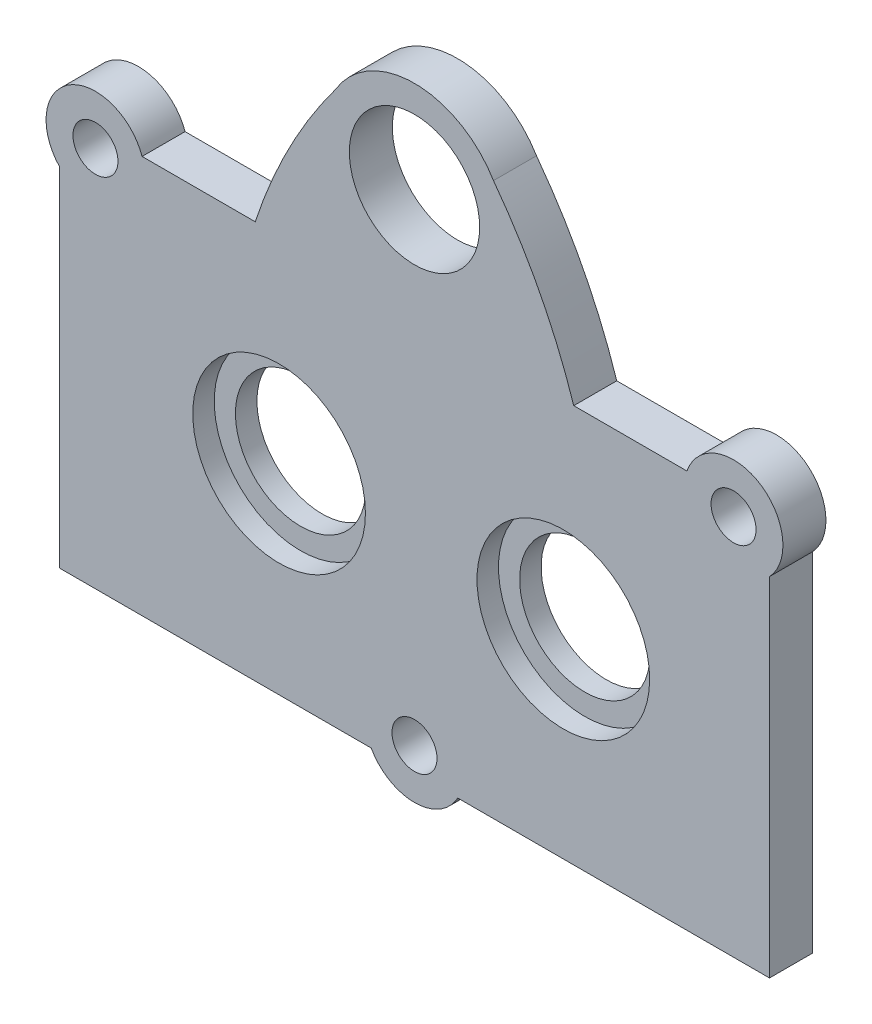
ISO-10303-21;
HEADER;
FILE_DESCRIPTION(('STEP AP214'),'2;1');
FILE_NAME('part.step','',(''),(''),'','','');
FILE_SCHEMA(('AUTOMOTIVE_DESIGN { 1 0 10303 214 1 1 1 1 }'));
ENDSEC;
DATA;
#1=APPLICATION_CONTEXT('core data for automotive mechanical design processes');
#2=APPLICATION_PROTOCOL_DEFINITION('international standard','automotive_design',2000,#1);
#3=PRODUCT_CONTEXT('',#1,'mechanical');
#4=PRODUCT('Part','Part','',(#3));
#5=PRODUCT_RELATED_PRODUCT_CATEGORY('part','',(#4));
#6=PRODUCT_DEFINITION_FORMATION('','',#4);
#7=PRODUCT_DEFINITION_CONTEXT('part definition',#1,'design');
#8=PRODUCT_DEFINITION('design','',#6,#7);
#9=PRODUCT_DEFINITION_SHAPE('','',#8);
#10=(LENGTH_UNIT() NAMED_UNIT(*) SI_UNIT(.MILLI.,.METRE.));
#11=(NAMED_UNIT(*) PLANE_ANGLE_UNIT() SI_UNIT($,.RADIAN.));
#12=(NAMED_UNIT(*) SI_UNIT($,.STERADIAN.) SOLID_ANGLE_UNIT());
#13=UNCERTAINTY_MEASURE_WITH_UNIT(LENGTH_MEASURE(1.E-05),#10,'distance_accuracy_value','');
#14=(GEOMETRIC_REPRESENTATION_CONTEXT(3) GLOBAL_UNCERTAINTY_ASSIGNED_CONTEXT((#13)) GLOBAL_UNIT_ASSIGNED_CONTEXT((#10,
#11,#12)) REPRESENTATION_CONTEXT('',''));
#15=CARTESIAN_POINT('',(0.,0.,0.));
#16=DIRECTION('',(0.,0.,1.));
#17=DIRECTION('',(1.,0.,0.));
#18=AXIS2_PLACEMENT_3D('',#15,#16,#17);
#19=CARTESIAN_POINT('',(-10.076,0.110000000000002,10.));
#20=DIRECTION('',(0.,0.,-1.));
#21=DIRECTION('',(-1.,0.,0.));
#22=AXIS2_PLACEMENT_3D('',#19,#20,#21);
#23=CYLINDRICAL_SURFACE('',#22,4.85);
#24=CARTESIAN_POINT('',(-10.076,0.110000000000002,0.));
#25=DIRECTION('',(0.,0.,-1.));
#26=DIRECTION('',(-1.,0.,0.));
#27=AXIS2_PLACEMENT_3D('',#24,#25,#26);
#28=CIRCLE('',#27,4.85);
#29=CARTESIAN_POINT('',(-14.926,0.110000000000002,0.));
#30=VERTEX_POINT('',#29);
#31=EDGE_CURVE('E322',#30,#30,#28,.T.);
#32=ORIENTED_EDGE('',*,*,#31,.T.);
#33=EDGE_LOOP('',(#32));
#34=FACE_BOUND('',#33,.T.);
#35=CARTESIAN_POINT('',(-10.076,0.110000000000002,1.6));
#36=DIRECTION('',(0.,0.,1.));
#37=DIRECTION('',(1.,0.,0.));
#38=AXIS2_PLACEMENT_3D('',#35,#36,#37);
#39=CIRCLE('',#38,4.85);
#40=CARTESIAN_POINT('',(-5.22600000000001,0.110000000000002,1.6));
#41=VERTEX_POINT('',#40);
#42=EDGE_CURVE('E66',#41,#41,#39,.F.);
#43=ORIENTED_EDGE('',*,*,#42,.F.);
#44=EDGE_LOOP('',(#43));
#45=FACE_BOUND('',#44,.T.);
#46=ADVANCED_FACE('F62',(#34,#45),#23,.F.);
#47=CARTESIAN_POINT('',(11.074,0.,-184.8));
#48=DIRECTION('',(0.,0.,1.));
#49=DIRECTION('',(1.,0.,0.));
#50=AXIS2_PLACEMENT_3D('',#47,#48,#49);
#51=CYLINDRICAL_SURFACE('',#50,4.85);
#52=CARTESIAN_POINT('',(11.074,0.,0.));
#53=DIRECTION('',(0.,0.,1.));
#54=DIRECTION('',(1.,0.,0.));
#55=AXIS2_PLACEMENT_3D('',#52,#53,#54);
#56=CIRCLE('',#55,4.85);
#57=CARTESIAN_POINT('',(15.924,0.,0.));
#58=VERTEX_POINT('',#57);
#59=EDGE_CURVE('E276',#58,#58,#56,.T.);
#60=ORIENTED_EDGE('',*,*,#59,.F.);
#61=EDGE_LOOP('',(#60));
#62=FACE_BOUND('',#61,.T.);
#63=CARTESIAN_POINT('',(11.074,0.,1.59999999999999));
#64=DIRECTION('',(0.,0.,1.));
#65=DIRECTION('',(1.,0.,0.));
#66=AXIS2_PLACEMENT_3D('',#63,#64,#65);
#67=CIRCLE('',#66,4.85);
#68=CARTESIAN_POINT('',(15.924,0.,1.59999999999999));
#69=VERTEX_POINT('',#68);
#70=EDGE_CURVE('E221',#69,#69,#67,.F.);
#71=ORIENTED_EDGE('',*,*,#70,.F.);
#72=EDGE_LOOP('',(#71));
#73=FACE_BOUND('',#72,.T.);
#74=ADVANCED_FACE('F373',(#62,#73),#51,.F.);
#75=CARTESIAN_POINT('',(-26.416,14.8,3.2));
#76=DIRECTION('',(0.,1.,0.));
#77=DIRECTION('',(0.,0.,1.));
#78=AXIS2_PLACEMENT_3D('',#75,#76,#77);
#79=PLANE('',#78);
#80=DIRECTION('',(1.,0.,0.));
#81=VECTOR('',#80,1.);
#82=CARTESIAN_POINT('',(-26.416,14.8,3.2));
#83=LINE('',#82,#81);
#84=CARTESIAN_POINT('',(-20.2719574808025,14.8,3.2));
#85=VERTEX_POINT('',#84);
#86=CARTESIAN_POINT('',(-11.85,14.8,3.2));
#87=VERTEX_POINT('',#86);
#88=EDGE_CURVE('E172',#85,#87,#83,.T.);
#89=ORIENTED_EDGE('',*,*,#88,.T.);
#90=DIRECTION('',(0.,0.,1.));
#91=VECTOR('',#90,1.);
#92=CARTESIAN_POINT('',(-11.85,14.8,-12.9729167291074));
#93=LINE('',#92,#91);
#94=CARTESIAN_POINT('',(-11.85,14.8,0.));
#95=VERTEX_POINT('',#94);
#96=EDGE_CURVE('E154',#95,#87,#93,.T.);
#97=ORIENTED_EDGE('',*,*,#96,.F.);
#98=DIRECTION('',(1.,0.,0.));
#99=VECTOR('',#98,1.);
#100=CARTESIAN_POINT('',(-26.416,14.8,0.));
#101=LINE('',#100,#99);
#102=CARTESIAN_POINT('',(-20.2719574808025,14.8,0.));
#103=VERTEX_POINT('',#102);
#104=EDGE_CURVE('E192',#103,#95,#101,.T.);
#105=ORIENTED_EDGE('',*,*,#104,.F.);
#106=DIRECTION('',(0.,0.,-1.));
#107=VECTOR('',#106,1.);
#108=CARTESIAN_POINT('',(-20.2719574808025,14.8,13.5944696834423));
#109=LINE('',#108,#107);
#110=EDGE_CURVE('E181',#85,#103,#109,.T.);
#111=ORIENTED_EDGE('',*,*,#110,.F.);
#112=EDGE_LOOP('',(#89,#97,#105,#111));
#113=FACE_BOUND('',#112,.T.);
#114=ADVANCED_FACE('F179',(#113),#79,.T.);
#115=CARTESIAN_POINT('',(0.,22.8,-20.204269350808));
#116=DIRECTION('',(0.,0.,1.));
#117=DIRECTION('',(1.,0.,0.));
#118=AXIS2_PLACEMENT_3D('',#115,#116,#117);
#119=CYLINDRICAL_SURFACE('',#118,6.85);
#120=DIRECTION('',(0.,0.,1.));
#121=VECTOR('',#120,1.);
#122=CARTESIAN_POINT('',(5.8783394918237,26.3167634010359,-12.9729167291074));
#123=LINE('',#122,#121);
#124=CARTESIAN_POINT('',(5.8783394918237,26.3167634010359,0.));
#125=VERTEX_POINT('',#124);
#126=CARTESIAN_POINT('',(5.8783394918237,26.3167634010359,3.2));
#127=VERTEX_POINT('',#126);
#128=EDGE_CURVE('E88',#125,#127,#123,.T.);
#129=ORIENTED_EDGE('',*,*,#128,.F.);
#130=CARTESIAN_POINT('',(0.,22.8,0.));
#131=DIRECTION('',(0.,0.,1.));
#132=DIRECTION('',(1.,0.,0.));
#133=AXIS2_PLACEMENT_3D('',#130,#131,#132);
#134=CIRCLE('',#133,6.85);
#135=CARTESIAN_POINT('',(-5.87833949182367,26.316763401036,0.));
#136=VERTEX_POINT('',#135);
#137=EDGE_CURVE('E266',#136,#125,#134,.F.);
#138=ORIENTED_EDGE('',*,*,#137,.F.);
#139=DIRECTION('',(0.,0.,1.));
#140=VECTOR('',#139,1.);
#141=CARTESIAN_POINT('',(-5.87833949182367,26.316763401036,-12.9729167291074));
#142=LINE('',#141,#140);
#143=CARTESIAN_POINT('',(-5.87833949182367,26.316763401036,3.2));
#144=VERTEX_POINT('',#143);
#145=EDGE_CURVE('E165',#136,#144,#142,.T.);
#146=ORIENTED_EDGE('',*,*,#145,.T.);
#147=CARTESIAN_POINT('',(0.,22.8,3.2));
#148=DIRECTION('',(0.,0.,1.));
#149=DIRECTION('',(1.,0.,0.));
#150=AXIS2_PLACEMENT_3D('',#147,#148,#149);
#151=CIRCLE('',#150,6.85);
#152=EDGE_CURVE('E175',#127,#144,#151,.T.);
#153=ORIENTED_EDGE('',*,*,#152,.F.);
#154=EDGE_LOOP('',(#129,#138,#146,#153));
#155=FACE_BOUND('',#154,.T.);
#156=ADVANCED_FACE('F365',(#155),#119,.T.);
#157=DIRECTION('',(0.,0.,1.));
#158=VECTOR('',#157,1.);
#159=CARTESIAN_POINT('',(11.85,14.8,-12.9729167291074));
#160=LINE('',#159,#158);
#161=CARTESIAN_POINT('',(11.85,14.8,0.));
#162=VERTEX_POINT('',#161);
#163=CARTESIAN_POINT('',(11.85,14.8,3.2));
#164=VERTEX_POINT('',#163);
#165=EDGE_CURVE('E252',#162,#164,#160,.T.);
#166=ORIENTED_EDGE('',*,*,#165,.T.);
#167=CARTESIAN_POINT('',(20.2719574808025,14.8,3.2));
#168=VERTEX_POINT('',#167);
#169=EDGE_CURVE('E185',#164,#168,#83,.T.);
#170=ORIENTED_EDGE('',*,*,#169,.T.);
#171=DIRECTION('',(0.,0.,-1.));
#172=VECTOR('',#171,1.);
#173=CARTESIAN_POINT('',(20.2719574808025,14.8,13.5944696834423));
#174=LINE('',#173,#172);
#175=CARTESIAN_POINT('',(20.2719574808025,14.8,0.));
#176=VERTEX_POINT('',#175);
#177=EDGE_CURVE('E298',#176,#168,#174,.F.);
#178=ORIENTED_EDGE('',*,*,#177,.F.);
#179=EDGE_CURVE('E80',#162,#176,#101,.T.);
#180=ORIENTED_EDGE('',*,*,#179,.F.);
#181=EDGE_LOOP('',(#166,#170,#178,#180));
#182=FACE_BOUND('',#181,.T.);
#183=ADVANCED_FACE('F356',(#182),#79,.T.);
#184=CARTESIAN_POINT('',(26.416,-14.8,3.2));
#185=DIRECTION('',(0.,-1.,0.));
#186=DIRECTION('',(1.,0.,0.));
#187=AXIS2_PLACEMENT_3D('',#184,#185,#186);
#188=PLANE('',#187);
#189=DIRECTION('',(0.,0.,1.));
#190=VECTOR('',#189,1.);
#191=CARTESIAN_POINT('',(3.21791858194081,-14.8,-10.3944696834422));
#192=LINE('',#191,#190);
#193=CARTESIAN_POINT('',(3.21791858194081,-14.8,0.));
#194=VERTEX_POINT('',#193);
#195=CARTESIAN_POINT('',(3.21791858194081,-14.8,3.2));
#196=VERTEX_POINT('',#195);
#197=EDGE_CURVE('E72',#194,#196,#192,.T.);
#198=ORIENTED_EDGE('',*,*,#197,.F.);
#199=DIRECTION('',(-1.,0.,0.));
#200=VECTOR('',#199,1.);
#201=CARTESIAN_POINT('',(26.416,-14.8,0.));
#202=LINE('',#201,#200);
#203=CARTESIAN_POINT('',(26.416,-14.8,0.));
#204=VERTEX_POINT('',#203);
#205=EDGE_CURVE('E203',#204,#194,#202,.T.);
#206=ORIENTED_EDGE('',*,*,#205,.F.);
#207=DIRECTION('',(0.,0.,-1.));
#208=VECTOR('',#207,1.);
#209=CARTESIAN_POINT('',(26.416,-14.8,3.2));
#210=LINE('',#209,#208);
#211=CARTESIAN_POINT('',(26.416,-14.8,3.2));
#212=VERTEX_POINT('',#211);
#213=EDGE_CURVE('E208',#212,#204,#210,.T.);
#214=ORIENTED_EDGE('',*,*,#213,.F.);
#215=DIRECTION('',(-1.,0.,0.));
#216=VECTOR('',#215,1.);
#217=CARTESIAN_POINT('',(26.416,-14.8,3.2));
#218=LINE('',#217,#216);
#219=EDGE_CURVE('E197',#212,#196,#218,.T.);
#220=ORIENTED_EDGE('',*,*,#219,.T.);
#221=EDGE_LOOP('',(#198,#206,#214,#220));
#222=FACE_BOUND('',#221,.T.);
#223=ADVANCED_FACE('F372',(#222),#188,.T.);
#224=CARTESIAN_POINT('',(0.,0.,0.));
#225=DIRECTION('',(0.,0.,1.));
#226=DIRECTION('',(1.,0.,0.));
#227=AXIS2_PLACEMENT_3D('',#224,#225,#226);
#228=PLANE('',#227);
#229=CARTESIAN_POINT('',(-26.1760004723436,2.38938808610461,0.));
#230=DIRECTION('',(0.,0.,1.));
#231=DIRECTION('',(1.,0.,0.));
#232=AXIS2_PLACEMENT_3D('',#229,#230,#231);
#233=CIRCLE('',#232,40.);
#234=EDGE_CURVE('E177',#125,#162,#233,.F.);
#235=ORIENTED_EDGE('',*,*,#234,.T.);
#236=ORIENTED_EDGE('',*,*,#179,.T.);
#237=CARTESIAN_POINT('',(23.741,13.587,0.));
#238=DIRECTION('',(0.,0.,-1.));
#239=DIRECTION('',(-1.,0.,0.));
#240=AXIS2_PLACEMENT_3D('',#237,#238,#239);
#241=CIRCLE('',#240,3.675);
#242=CARTESIAN_POINT('',(26.416,11.0670793663292,0.));
#243=VERTEX_POINT('',#242);
#244=EDGE_CURVE('E294',#176,#243,#241,.T.);
#245=ORIENTED_EDGE('',*,*,#244,.T.);
#246=DIRECTION('',(0.,1.,0.));
#247=VECTOR('',#246,1.);
#248=CARTESIAN_POINT('',(26.416,0.,0.));
#249=LINE('',#248,#247);
#250=EDGE_CURVE('E184',#204,#243,#249,.T.);
#251=ORIENTED_EDGE('',*,*,#250,.F.);
#252=ORIENTED_EDGE('',*,*,#205,.T.);
#253=CARTESIAN_POINT('',(0.,-13.025,0.));
#254=DIRECTION('',(0.,0.,1.));
#255=DIRECTION('',(1.,0.,0.));
#256=AXIS2_PLACEMENT_3D('',#253,#254,#255);
#257=CIRCLE('',#256,3.675);
#258=CARTESIAN_POINT('',(-3.21791858194082,-14.8,0.));
#259=VERTEX_POINT('',#258);
#260=EDGE_CURVE('E306',#194,#259,#257,.F.);
#261=ORIENTED_EDGE('',*,*,#260,.T.);
#262=CARTESIAN_POINT('',(-26.416,-14.8,0.));
#263=VERTEX_POINT('',#262);
#264=EDGE_CURVE('E207',#259,#263,#202,.T.);
#265=ORIENTED_EDGE('',*,*,#264,.T.);
#266=DIRECTION('',(0.,1.,0.));
#267=VECTOR('',#266,1.);
#268=CARTESIAN_POINT('',(-26.416,0.,0.));
#269=LINE('',#268,#267);
#270=CARTESIAN_POINT('',(-26.416,11.0670793663292,0.));
#271=VERTEX_POINT('',#270);
#272=EDGE_CURVE('E342',#263,#271,#269,.T.);
#273=ORIENTED_EDGE('',*,*,#272,.T.);
#274=CARTESIAN_POINT('',(-23.741,13.587,0.));
#275=DIRECTION('',(0.,0.,-1.));
#276=DIRECTION('',(-1.,0.,0.));
#277=AXIS2_PLACEMENT_3D('',#274,#275,#276);
#278=CIRCLE('',#277,3.675);
#279=EDGE_CURVE('E280',#271,#103,#278,.T.);
#280=ORIENTED_EDGE('',*,*,#279,.T.);
#281=ORIENTED_EDGE('',*,*,#104,.T.);
#282=CARTESIAN_POINT('',(26.1760004723436,2.38938808610461,0.));
#283=DIRECTION('',(0.,0.,1.));
#284=DIRECTION('',(1.,0.,0.));
#285=AXIS2_PLACEMENT_3D('',#282,#283,#284);
#286=CIRCLE('',#285,40.);
#287=EDGE_CURVE('E160',#136,#95,#286,.T.);
#288=ORIENTED_EDGE('',*,*,#287,.F.);
#289=ORIENTED_EDGE('',*,*,#137,.T.);
#290=EDGE_LOOP('',(#235,#236,#245,#251,#252,#261,#265,#273,#280,#281,#288,#289));
#291=FACE_BOUND('',#290,.T.);
#292=ORIENTED_EDGE('',*,*,#59,.T.);
#293=EDGE_LOOP('',(#292));
#294=FACE_BOUND('',#293,.T.);
#295=CARTESIAN_POINT('',(-23.741,13.587,0.));
#296=DIRECTION('',(0.,0.,1.));
#297=DIRECTION('',(1.,0.,0.));
#298=AXIS2_PLACEMENT_3D('',#295,#296,#297);
#299=CIRCLE('',#298,1.675);
#300=CARTESIAN_POINT('',(-22.066,13.587,0.));
#301=VERTEX_POINT('',#300);
#302=EDGE_CURVE('E317',#301,#301,#299,.F.);
#303=ORIENTED_EDGE('',*,*,#302,.F.);
#304=EDGE_LOOP('',(#303));
#305=FACE_BOUND('',#304,.T.);
#306=ORIENTED_EDGE('',*,*,#31,.F.);
#307=EDGE_LOOP('',(#306));
#308=FACE_BOUND('',#307,.T.);
#309=CARTESIAN_POINT('',(23.741,13.587,0.));
#310=DIRECTION('',(0.,0.,1.));
#311=DIRECTION('',(1.,0.,0.));
#312=AXIS2_PLACEMENT_3D('',#309,#310,#311);
#313=CIRCLE('',#312,1.675);
#314=CARTESIAN_POINT('',(25.416,13.587,0.));
#315=VERTEX_POINT('',#314);
#316=EDGE_CURVE('E323',#315,#315,#313,.F.);
#317=ORIENTED_EDGE('',*,*,#316,.F.);
#318=EDGE_LOOP('',(#317));
#319=FACE_BOUND('',#318,.T.);
#320=CARTESIAN_POINT('',(0.,-13.025,0.));
#321=DIRECTION('',(0.,0.,1.));
#322=DIRECTION('',(1.,0.,0.));
#323=AXIS2_PLACEMENT_3D('',#320,#321,#322);
#324=CIRCLE('',#323,1.675);
#325=CARTESIAN_POINT('',(1.675,-13.025,0.));
#326=VERTEX_POINT('',#325);
#327=EDGE_CURVE('E309',#326,#326,#324,.F.);
#328=ORIENTED_EDGE('',*,*,#327,.F.);
#329=EDGE_LOOP('',(#328));
#330=FACE_BOUND('',#329,.T.);
#331=CARTESIAN_POINT('',(0.,22.8,0.));
#332=DIRECTION('',(0.,0.,1.));
#333=DIRECTION('',(1.,0.,0.));
#334=AXIS2_PLACEMENT_3D('',#331,#332,#333);
#335=CIRCLE('',#334,4.85);
#336=CARTESIAN_POINT('',(4.85,22.8,0.));
#337=VERTEX_POINT('',#336);
#338=EDGE_CURVE('E260',#337,#337,#335,.F.);
#339=ORIENTED_EDGE('',*,*,#338,.F.);
#340=EDGE_LOOP('',(#339));
#341=FACE_BOUND('',#340,.T.);
#342=ADVANCED_FACE('F363',(#291,#294,#305,#308,#319,#330,#341),#228,.F.);
#343=CARTESIAN_POINT('',(-26.416,0.,3.2));
#344=DIRECTION('',(-1.,0.,0.));
#345=DIRECTION('',(0.,0.,1.));
#346=AXIS2_PLACEMENT_3D('',#343,#344,#345);
#347=PLANE('',#346);
#348=DIRECTION('',(0.,0.,-1.));
#349=VECTOR('',#348,1.);
#350=CARTESIAN_POINT('',(-26.416,11.0670793663292,13.5944696834423));
#351=LINE('',#350,#349);
#352=CARTESIAN_POINT('',(-26.416,11.0670793663292,3.2));
#353=VERTEX_POINT('',#352);
#354=EDGE_CURVE('E284',#271,#353,#351,.F.);
#355=ORIENTED_EDGE('',*,*,#354,.F.);
#356=ORIENTED_EDGE('',*,*,#272,.F.);
#357=DIRECTION('',(0.,0.,-1.));
#358=VECTOR('',#357,1.);
#359=CARTESIAN_POINT('',(-26.416,-14.8,3.2));
#360=LINE('',#359,#358);
#361=CARTESIAN_POINT('',(-26.416,-14.8,3.2));
#362=VERTEX_POINT('',#361);
#363=EDGE_CURVE('E201',#362,#263,#360,.T.);
#364=ORIENTED_EDGE('',*,*,#363,.F.);
#365=DIRECTION('',(0.,1.,0.));
#366=VECTOR('',#365,1.);
#367=CARTESIAN_POINT('',(-26.416,0.,3.2));
#368=LINE('',#367,#366);
#369=EDGE_CURVE('E219',#362,#353,#368,.T.);
#370=ORIENTED_EDGE('',*,*,#369,.T.);
#371=EDGE_LOOP('',(#355,#356,#364,#370));
#372=FACE_BOUND('',#371,.T.);
#373=ADVANCED_FACE('F391',(#372),#347,.T.);
#374=CARTESIAN_POINT('',(0.,0.,3.2));
#375=DIRECTION('',(0.,0.,1.));
#376=DIRECTION('',(1.,0.,0.));
#377=AXIS2_PLACEMENT_3D('',#374,#375,#376);
#378=PLANE('',#377);
#379=CARTESIAN_POINT('',(-10.076,0.110000000000002,3.2));
#380=DIRECTION('',(0.,0.,1.));
#381=DIRECTION('',(1.,0.,0.));
#382=AXIS2_PLACEMENT_3D('',#379,#380,#381);
#383=CIRCLE('',#382,6.425);
#384=CARTESIAN_POINT('',(-3.65100000000001,0.110000000000002,3.2));
#385=VERTEX_POINT('',#384);
#386=EDGE_CURVE('E233',#385,#385,#383,.T.);
#387=ORIENTED_EDGE('',*,*,#386,.F.);
#388=EDGE_LOOP('',(#387));
#389=FACE_BOUND('',#388,.T.);
#390=CARTESIAN_POINT('',(11.074,0.,3.2));
#391=DIRECTION('',(0.,0.,1.));
#392=DIRECTION('',(1.,0.,0.));
#393=AXIS2_PLACEMENT_3D('',#390,#391,#392);
#394=CIRCLE('',#393,6.425);
#395=CARTESIAN_POINT('',(17.499,0.,3.2));
#396=VERTEX_POINT('',#395);
#397=EDGE_CURVE('E240',#396,#396,#394,.T.);
#398=ORIENTED_EDGE('',*,*,#397,.F.);
#399=EDGE_LOOP('',(#398));
#400=FACE_BOUND('',#399,.T.);
#401=ORIENTED_EDGE('',*,*,#169,.F.);
#402=CARTESIAN_POINT('',(-26.1760004723436,2.38938808610461,3.2));
#403=DIRECTION('',(0.,0.,1.));
#404=DIRECTION('',(1.,0.,0.));
#405=AXIS2_PLACEMENT_3D('',#402,#403,#404);
#406=CIRCLE('',#405,40.);
#407=EDGE_CURVE('E231',#164,#127,#406,.T.);
#408=ORIENTED_EDGE('',*,*,#407,.T.);
#409=ORIENTED_EDGE('',*,*,#152,.T.);
#410=CARTESIAN_POINT('',(26.1760004723436,2.38938808610461,3.2));
#411=DIRECTION('',(0.,0.,1.));
#412=DIRECTION('',(1.,0.,0.));
#413=AXIS2_PLACEMENT_3D('',#410,#411,#412);
#414=CIRCLE('',#413,40.);
#415=EDGE_CURVE('E158',#87,#144,#414,.F.);
#416=ORIENTED_EDGE('',*,*,#415,.F.);
#417=ORIENTED_EDGE('',*,*,#88,.F.);
#418=CARTESIAN_POINT('',(-23.741,13.587,3.2));
#419=DIRECTION('',(0.,0.,1.));
#420=DIRECTION('',(1.,0.,0.));
#421=AXIS2_PLACEMENT_3D('',#418,#419,#420);
#422=CIRCLE('',#421,3.675);
#423=EDGE_CURVE('E281',#353,#85,#422,.F.);
#424=ORIENTED_EDGE('',*,*,#423,.F.);
#425=ORIENTED_EDGE('',*,*,#369,.F.);
#426=CARTESIAN_POINT('',(-3.21791858194081,-14.8,3.2));
#427=VERTEX_POINT('',#426);
#428=EDGE_CURVE('E202',#427,#362,#218,.T.);
#429=ORIENTED_EDGE('',*,*,#428,.F.);
#430=CARTESIAN_POINT('',(0.,-13.025,3.2));
#431=DIRECTION('',(0.,0.,1.));
#432=DIRECTION('',(1.,0.,0.));
#433=AXIS2_PLACEMENT_3D('',#430,#431,#432);
#434=CIRCLE('',#433,3.675);
#435=EDGE_CURVE('E305',#427,#196,#434,.T.);
#436=ORIENTED_EDGE('',*,*,#435,.T.);
#437=ORIENTED_EDGE('',*,*,#219,.F.);
#438=DIRECTION('',(0.,1.,0.));
#439=VECTOR('',#438,1.);
#440=CARTESIAN_POINT('',(26.416,0.,3.2));
#441=LINE('',#440,#439);
#442=CARTESIAN_POINT('',(26.416,11.0670793663292,3.2));
#443=VERTEX_POINT('',#442);
#444=EDGE_CURVE('E190',#212,#443,#441,.T.);
#445=ORIENTED_EDGE('',*,*,#444,.T.);
#446=CARTESIAN_POINT('',(23.741,13.587,3.2));
#447=DIRECTION('',(0.,0.,1.));
#448=DIRECTION('',(1.,0.,0.));
#449=AXIS2_PLACEMENT_3D('',#446,#447,#448);
#450=CIRCLE('',#449,3.675);
#451=EDGE_CURVE('E293',#168,#443,#450,.F.);
#452=ORIENTED_EDGE('',*,*,#451,.F.);
#453=EDGE_LOOP('',(#401,#408,#409,#416,#417,#424,#425,#429,#436,#437,#445,#452));
#454=FACE_BOUND('',#453,.T.);
#455=CARTESIAN_POINT('',(-23.741,13.587,3.2));
#456=DIRECTION('',(0.,0.,1.));
#457=DIRECTION('',(1.,0.,0.));
#458=AXIS2_PLACEMENT_3D('',#455,#456,#457);
#459=CIRCLE('',#458,1.675);
#460=CARTESIAN_POINT('',(-22.066,13.587,3.2));
#461=VERTEX_POINT('',#460);
#462=EDGE_CURVE('E313',#461,#461,#459,.T.);
#463=ORIENTED_EDGE('',*,*,#462,.F.);
#464=EDGE_LOOP('',(#463));
#465=FACE_BOUND('',#464,.T.);
#466=CARTESIAN_POINT('',(23.741,13.587,3.2));
#467=DIRECTION('',(0.,0.,1.));
#468=DIRECTION('',(1.,0.,0.));
#469=AXIS2_PLACEMENT_3D('',#466,#467,#468);
#470=CIRCLE('',#469,1.675);
#471=CARTESIAN_POINT('',(25.416,13.587,3.2));
#472=VERTEX_POINT('',#471);
#473=EDGE_CURVE('E318',#472,#472,#470,.T.);
#474=ORIENTED_EDGE('',*,*,#473,.F.);
#475=EDGE_LOOP('',(#474));
#476=FACE_BOUND('',#475,.T.);
#477=CARTESIAN_POINT('',(0.,-13.025,3.2));
#478=DIRECTION('',(0.,0.,1.));
#479=DIRECTION('',(1.,0.,0.));
#480=AXIS2_PLACEMENT_3D('',#477,#478,#479);
#481=CIRCLE('',#480,1.675);
#482=CARTESIAN_POINT('',(1.675,-13.025,3.2));
#483=VERTEX_POINT('',#482);
#484=EDGE_CURVE('E327',#483,#483,#481,.T.);
#485=ORIENTED_EDGE('',*,*,#484,.F.);
#486=EDGE_LOOP('',(#485));
#487=FACE_BOUND('',#486,.T.);
#488=CARTESIAN_POINT('',(0.,22.8,3.2));
#489=DIRECTION('',(0.,0.,1.));
#490=DIRECTION('',(1.,0.,0.));
#491=AXIS2_PLACEMENT_3D('',#488,#489,#490);
#492=CIRCLE('',#491,4.85);
#493=CARTESIAN_POINT('',(4.85,22.8,3.2));
#494=VERTEX_POINT('',#493);
#495=EDGE_CURVE('E267',#494,#494,#492,.T.);
#496=ORIENTED_EDGE('',*,*,#495,.F.);
#497=EDGE_LOOP('',(#496));
#498=FACE_BOUND('',#497,.T.);
#499=ADVANCED_FACE('F169',(#389,#400,#454,#465,#476,#487,#498),#378,.T.);
#500=CARTESIAN_POINT('',(26.416,0.,3.2));
#501=DIRECTION('',(-1.,0.,0.));
#502=DIRECTION('',(0.,0.,1.));
#503=AXIS2_PLACEMENT_3D('',#500,#501,#502);
#504=PLANE('',#503);
#505=ORIENTED_EDGE('',*,*,#250,.T.);
#506=DIRECTION('',(0.,0.,-1.));
#507=VECTOR('',#506,1.);
#508=CARTESIAN_POINT('',(26.416,11.0670793663292,13.5944696834423));
#509=LINE('',#508,#507);
#510=EDGE_CURVE('E12',#243,#443,#509,.F.);
#511=ORIENTED_EDGE('',*,*,#510,.T.);
#512=ORIENTED_EDGE('',*,*,#444,.F.);
#513=ORIENTED_EDGE('',*,*,#213,.T.);
#514=EDGE_LOOP('',(#505,#511,#512,#513));
#515=FACE_BOUND('',#514,.T.);
#516=ADVANCED_FACE('F390',(#515),#504,.F.);
#517=DIRECTION('',(0.,0.,1.));
#518=VECTOR('',#517,1.);
#519=CARTESIAN_POINT('',(-3.21791858194081,-14.8,-10.3944696834422));
#520=LINE('',#519,#518);
#521=EDGE_CURVE('E215',#427,#259,#520,.F.);
#522=ORIENTED_EDGE('',*,*,#521,.F.);
#523=ORIENTED_EDGE('',*,*,#428,.T.);
#524=ORIENTED_EDGE('',*,*,#363,.T.);
#525=ORIENTED_EDGE('',*,*,#264,.F.);
#526=EDGE_LOOP('',(#522,#523,#524,#525));
#527=FACE_BOUND('',#526,.T.);
#528=ADVANCED_FACE('F64',(#527),#188,.T.);
#529=CARTESIAN_POINT('',(23.741,13.587,-4.73761543394987));
#530=DIRECTION('',(0.,0.,1.));
#531=DIRECTION('',(1.,0.,0.));
#532=AXIS2_PLACEMENT_3D('',#529,#530,#531);
#533=CYLINDRICAL_SURFACE('',#532,1.675);
#534=ORIENTED_EDGE('',*,*,#473,.T.);
#535=EDGE_LOOP('',(#534));
#536=FACE_BOUND('',#535,.T.);
#537=ORIENTED_EDGE('',*,*,#316,.T.);
#538=EDGE_LOOP('',(#537));
#539=FACE_BOUND('',#538,.T.);
#540=ADVANCED_FACE('F393',(#536,#539),#533,.F.);
#541=CARTESIAN_POINT('',(-23.741,13.587,-4.73761543394987));
#542=DIRECTION('',(0.,0.,1.));
#543=DIRECTION('',(1.,0.,0.));
#544=AXIS2_PLACEMENT_3D('',#541,#542,#543);
#545=CYLINDRICAL_SURFACE('',#544,1.675);
#546=ORIENTED_EDGE('',*,*,#462,.T.);
#547=EDGE_LOOP('',(#546));
#548=FACE_BOUND('',#547,.T.);
#549=ORIENTED_EDGE('',*,*,#302,.T.);
#550=EDGE_LOOP('',(#549));
#551=FACE_BOUND('',#550,.T.);
#552=ADVANCED_FACE('F481',(#548,#551),#545,.F.);
#553=CARTESIAN_POINT('',(0.,-13.025,-4.73761543394987));
#554=DIRECTION('',(0.,0.,1.));
#555=DIRECTION('',(1.,0.,0.));
#556=AXIS2_PLACEMENT_3D('',#553,#554,#555);
#557=CYLINDRICAL_SURFACE('',#556,1.675);
#558=ORIENTED_EDGE('',*,*,#327,.T.);
#559=EDGE_LOOP('',(#558));
#560=FACE_BOUND('',#559,.T.);
#561=ORIENTED_EDGE('',*,*,#484,.T.);
#562=EDGE_LOOP('',(#561));
#563=FACE_BOUND('',#562,.T.);
#564=ADVANCED_FACE('F386',(#560,#563),#557,.F.);
#565=CARTESIAN_POINT('',(0.,-13.025,-10.3944696834422));
#566=DIRECTION('',(0.,0.,1.));
#567=DIRECTION('',(1.,0.,0.));
#568=AXIS2_PLACEMENT_3D('',#565,#566,#567);
#569=CYLINDRICAL_SURFACE('',#568,3.675);
#570=ORIENTED_EDGE('',*,*,#260,.F.);
#571=ORIENTED_EDGE('',*,*,#197,.T.);
#572=ORIENTED_EDGE('',*,*,#435,.F.);
#573=ORIENTED_EDGE('',*,*,#521,.T.);
#574=EDGE_LOOP('',(#570,#571,#572,#573));
#575=FACE_BOUND('',#574,.T.);
#576=ADVANCED_FACE('F408',(#575),#569,.T.);
#577=CARTESIAN_POINT('',(23.741,13.587,13.5944696834423));
#578=DIRECTION('',(0.,0.,-1.));
#579=DIRECTION('',(-1.,0.,0.));
#580=AXIS2_PLACEMENT_3D('',#577,#578,#579);
#581=CYLINDRICAL_SURFACE('',#580,3.675);
#582=ORIENTED_EDGE('',*,*,#244,.F.);
#583=ORIENTED_EDGE('',*,*,#177,.T.);
#584=ORIENTED_EDGE('',*,*,#451,.T.);
#585=ORIENTED_EDGE('',*,*,#510,.F.);
#586=EDGE_LOOP('',(#582,#583,#584,#585));
#587=FACE_BOUND('',#586,.T.);
#588=ADVANCED_FACE('F355',(#587),#581,.T.);
#589=CARTESIAN_POINT('',(-23.741,13.587,13.5944696834423));
#590=DIRECTION('',(0.,0.,-1.));
#591=DIRECTION('',(-1.,0.,0.));
#592=AXIS2_PLACEMENT_3D('',#589,#590,#591);
#593=CYLINDRICAL_SURFACE('',#592,3.675);
#594=ORIENTED_EDGE('',*,*,#423,.T.);
#595=ORIENTED_EDGE('',*,*,#110,.T.);
#596=ORIENTED_EDGE('',*,*,#279,.F.);
#597=ORIENTED_EDGE('',*,*,#354,.T.);
#598=EDGE_LOOP('',(#594,#595,#596,#597));
#599=FACE_BOUND('',#598,.T.);
#600=ADVANCED_FACE('F468',(#599),#593,.T.);
#601=CARTESIAN_POINT('',(0.,22.8,-20.204269350808));
#602=DIRECTION('',(0.,0.,1.));
#603=DIRECTION('',(1.,0.,0.));
#604=AXIS2_PLACEMENT_3D('',#601,#602,#603);
#605=CYLINDRICAL_SURFACE('',#604,4.85);
#606=ORIENTED_EDGE('',*,*,#338,.T.);
#607=EDGE_LOOP('',(#606));
#608=FACE_BOUND('',#607,.T.);
#609=ORIENTED_EDGE('',*,*,#495,.T.);
#610=EDGE_LOOP('',(#609));
#611=FACE_BOUND('',#610,.T.);
#612=ADVANCED_FACE('F470',(#608,#611),#605,.F.);
#613=CARTESIAN_POINT('',(26.1760004723436,2.38938808610461,-12.9729167291074));
#614=DIRECTION('',(0.,0.,1.));
#615=DIRECTION('',(1.,0.,0.));
#616=AXIS2_PLACEMENT_3D('',#613,#614,#615);
#617=CYLINDRICAL_SURFACE('',#616,40.);
#618=ORIENTED_EDGE('',*,*,#145,.F.);
#619=ORIENTED_EDGE('',*,*,#287,.T.);
#620=ORIENTED_EDGE('',*,*,#96,.T.);
#621=ORIENTED_EDGE('',*,*,#415,.T.);
#622=EDGE_LOOP('',(#618,#619,#620,#621));
#623=FACE_BOUND('',#622,.T.);
#624=ADVANCED_FACE('F157',(#623),#617,.T.);
#625=CARTESIAN_POINT('',(-26.1760004723436,2.38938808610461,-12.9729167291074));
#626=DIRECTION('',(0.,0.,1.));
#627=DIRECTION('',(1.,0.,0.));
#628=AXIS2_PLACEMENT_3D('',#625,#626,#627);
#629=CYLINDRICAL_SURFACE('',#628,40.);
#630=ORIENTED_EDGE('',*,*,#234,.F.);
#631=ORIENTED_EDGE('',*,*,#128,.T.);
#632=ORIENTED_EDGE('',*,*,#407,.F.);
#633=ORIENTED_EDGE('',*,*,#165,.F.);
#634=EDGE_LOOP('',(#630,#631,#632,#633));
#635=FACE_BOUND('',#634,.T.);
#636=ADVANCED_FACE('F361',(#635),#629,.T.);
#637=CARTESIAN_POINT('',(11.074,0.,1.6));
#638=DIRECTION('',(0.,0.,1.));
#639=DIRECTION('',(1.,0.,0.));
#640=AXIS2_PLACEMENT_3D('',#637,#638,#639);
#641=PLANE('',#640);
#642=CARTESIAN_POINT('',(11.074,0.,1.6));
#643=DIRECTION('',(0.,0.,1.));
#644=DIRECTION('',(1.,0.,0.));
#645=AXIS2_PLACEMENT_3D('',#642,#643,#644);
#646=CIRCLE('',#645,6.425);
#647=CARTESIAN_POINT('',(17.499,0.,1.6));
#648=VERTEX_POINT('',#647);
#649=EDGE_CURVE('E246',#648,#648,#646,.T.);
#650=ORIENTED_EDGE('',*,*,#649,.T.);
#651=EDGE_LOOP('',(#650));
#652=FACE_BOUND('',#651,.T.);
#653=ORIENTED_EDGE('',*,*,#70,.T.);
#654=EDGE_LOOP('',(#653));
#655=FACE_BOUND('',#654,.T.);
#656=ADVANCED_FACE('F539',(#652,#655),#641,.T.);
#657=CARTESIAN_POINT('',(11.074,0.,1.6));
#658=DIRECTION('',(0.,0.,1.));
#659=DIRECTION('',(1.,0.,0.));
#660=AXIS2_PLACEMENT_3D('',#657,#658,#659);
#661=CYLINDRICAL_SURFACE('',#660,6.425);
#662=ORIENTED_EDGE('',*,*,#649,.F.);
#663=EDGE_LOOP('',(#662));
#664=FACE_BOUND('',#663,.T.);
#665=ORIENTED_EDGE('',*,*,#397,.T.);
#666=EDGE_LOOP('',(#665));
#667=FACE_BOUND('',#666,.T.);
#668=ADVANCED_FACE('F548',(#664,#667),#661,.F.);
#669=CARTESIAN_POINT('',(-10.076,0.110000000000002,1.6));
#670=DIRECTION('',(0.,0.,1.));
#671=DIRECTION('',(1.,0.,0.));
#672=AXIS2_PLACEMENT_3D('',#669,#670,#671);
#673=PLANE('',#672);
#674=CARTESIAN_POINT('',(-10.076,0.110000000000002,1.6));
#675=DIRECTION('',(0.,0.,1.));
#676=DIRECTION('',(1.,0.,0.));
#677=AXIS2_PLACEMENT_3D('',#674,#675,#676);
#678=CIRCLE('',#677,6.425);
#679=CARTESIAN_POINT('',(-3.65100000000001,0.110000000000002,1.6));
#680=VERTEX_POINT('',#679);
#681=EDGE_CURVE('E224',#680,#680,#678,.T.);
#682=ORIENTED_EDGE('',*,*,#681,.T.);
#683=EDGE_LOOP('',(#682));
#684=FACE_BOUND('',#683,.T.);
#685=ORIENTED_EDGE('',*,*,#42,.T.);
#686=EDGE_LOOP('',(#685));
#687=FACE_BOUND('',#686,.T.);
#688=ADVANCED_FACE('F558',(#684,#687),#673,.T.);
#689=CARTESIAN_POINT('',(-10.076,0.110000000000002,1.6));
#690=DIRECTION('',(0.,0.,1.));
#691=DIRECTION('',(1.,0.,0.));
#692=AXIS2_PLACEMENT_3D('',#689,#690,#691);
#693=CYLINDRICAL_SURFACE('',#692,6.425);
#694=ORIENTED_EDGE('',*,*,#681,.F.);
#695=EDGE_LOOP('',(#694));
#696=FACE_BOUND('',#695,.T.);
#697=ORIENTED_EDGE('',*,*,#386,.T.);
#698=EDGE_LOOP('',(#697));
#699=FACE_BOUND('',#698,.T.);
#700=ADVANCED_FACE('F567',(#696,#699),#693,.F.);
#701=CLOSED_SHELL('',(#46,#74,#114,#156,#183,#223,#342,#373,#499,#516,#528,#540,#552,#564,#576,
#588,#600,#612,#624,#636,#656,#668,#688,#700));
#702=MANIFOLD_SOLID_BREP('B2',#701);
#703=ADVANCED_BREP_SHAPE_REPRESENTATION('',(#18,#702),#14);
#704=SHAPE_DEFINITION_REPRESENTATION(#9,#703);
ENDSEC;
END-ISO-10303-21;
